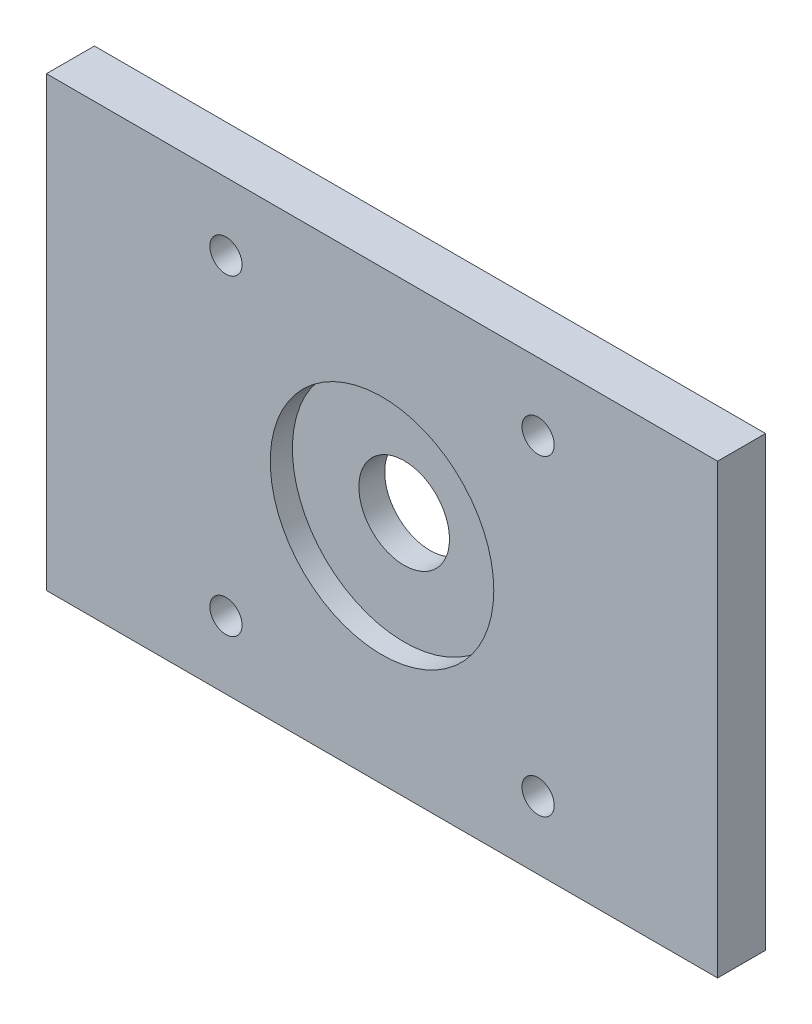
ISO-10303-21;
HEADER;
FILE_DESCRIPTION(('STEP AP214'),'2;1');
FILE_NAME('part.step','',(''),(''),'','','');
FILE_SCHEMA(('AUTOMOTIVE_DESIGN { 1 0 10303 214 1 1 1 1 }'));
ENDSEC;
DATA;
#1=APPLICATION_CONTEXT('core data for automotive mechanical design processes');
#2=APPLICATION_PROTOCOL_DEFINITION('international standard','automotive_design',2000,#1);
#3=PRODUCT_CONTEXT('',#1,'mechanical');
#4=PRODUCT('Part','Part','',(#3));
#5=PRODUCT_RELATED_PRODUCT_CATEGORY('part','',(#4));
#6=PRODUCT_DEFINITION_FORMATION('','',#4);
#7=PRODUCT_DEFINITION_CONTEXT('part definition',#1,'design');
#8=PRODUCT_DEFINITION('design','',#6,#7);
#9=PRODUCT_DEFINITION_SHAPE('','',#8);
#10=(LENGTH_UNIT() NAMED_UNIT(*) SI_UNIT(.MILLI.,.METRE.));
#11=(NAMED_UNIT(*) PLANE_ANGLE_UNIT() SI_UNIT($,.RADIAN.));
#12=(NAMED_UNIT(*) SI_UNIT($,.STERADIAN.) SOLID_ANGLE_UNIT());
#13=UNCERTAINTY_MEASURE_WITH_UNIT(LENGTH_MEASURE(1.E-05),#10,'distance_accuracy_value','');
#14=(GEOMETRIC_REPRESENTATION_CONTEXT(3) GLOBAL_UNCERTAINTY_ASSIGNED_CONTEXT((#13)) GLOBAL_UNIT_ASSIGNED_CONTEXT((#10,
#11,#12)) REPRESENTATION_CONTEXT('',''));
#15=CARTESIAN_POINT('',(0.,0.,0.));
#16=DIRECTION('',(0.,0.,1.));
#17=DIRECTION('',(1.,0.,0.));
#18=AXIS2_PLACEMENT_3D('',#15,#16,#17);
#19=CARTESIAN_POINT('',(0.,0.,4.7625));
#20=DIRECTION('',(0.,0.,-1.));
#21=DIRECTION('',(-1.,0.,0.));
#22=AXIS2_PLACEMENT_3D('',#19,#20,#21);
#23=PLANE('',#22);
#24=CARTESIAN_POINT('',(33.3248,22.225,4.7625));
#25=DIRECTION('',(0.,0.,1.));
#26=DIRECTION('',(1.,0.,0.));
#27=AXIS2_PLACEMENT_3D('',#24,#25,#26);
#28=CIRCLE('',#27,11.1);
#29=CARTESIAN_POINT('',(44.4248,22.225,4.7625));
#30=VERTEX_POINT('',#29);
#31=EDGE_CURVE('E137',#30,#30,#28,.T.);
#32=ORIENTED_EDGE('',*,*,#31,.F.);
#33=EDGE_LOOP('',(#32));
#34=FACE_BOUND('',#33,.T.);
#35=CARTESIAN_POINT('',(48.8248,37.725,4.7625));
#36=DIRECTION('',(0.,0.,1.));
#37=DIRECTION('',(1.,0.,0.));
#38=AXIS2_PLACEMENT_3D('',#35,#36,#37);
#39=CIRCLE('',#38,1.59999999999998);
#40=CARTESIAN_POINT('',(50.4248,37.725,4.7625));
#41=VERTEX_POINT('',#40);
#42=EDGE_CURVE('E133',#41,#41,#39,.T.);
#43=ORIENTED_EDGE('',*,*,#42,.F.);
#44=EDGE_LOOP('',(#43));
#45=FACE_BOUND('',#44,.T.);
#46=CARTESIAN_POINT('',(17.8248,6.72499999999999,4.7625));
#47=DIRECTION('',(0.,0.,1.));
#48=DIRECTION('',(1.,0.,0.));
#49=AXIS2_PLACEMENT_3D('',#46,#47,#48);
#50=CIRCLE('',#49,1.59999999999999);
#51=CARTESIAN_POINT('',(19.4248,6.72499999999999,4.7625));
#52=VERTEX_POINT('',#51);
#53=EDGE_CURVE('E127',#52,#52,#50,.T.);
#54=ORIENTED_EDGE('',*,*,#53,.F.);
#55=EDGE_LOOP('',(#54));
#56=FACE_BOUND('',#55,.T.);
#57=CARTESIAN_POINT('',(17.8248,37.725,4.7625));
#58=DIRECTION('',(0.,0.,1.));
#59=DIRECTION('',(1.,0.,0.));
#60=AXIS2_PLACEMENT_3D('',#57,#58,#59);
#61=CIRCLE('',#60,1.59999999999999);
#62=CARTESIAN_POINT('',(19.4248,37.725,4.7625));
#63=VERTEX_POINT('',#62);
#64=EDGE_CURVE('E121',#63,#63,#61,.T.);
#65=ORIENTED_EDGE('',*,*,#64,.F.);
#66=EDGE_LOOP('',(#65));
#67=FACE_BOUND('',#66,.T.);
#68=DIRECTION('',(0.,-1.,0.));
#69=VECTOR('',#68,1.);
#70=CARTESIAN_POINT('',(0.,0.,4.7625));
#71=LINE('',#70,#69);
#72=CARTESIAN_POINT('',(0.,44.45,4.7625));
#73=VERTEX_POINT('',#72);
#74=CARTESIAN_POINT('',(0.,0.,4.7625));
#75=VERTEX_POINT('',#74);
#76=EDGE_CURVE('E87',#73,#75,#71,.T.);
#77=ORIENTED_EDGE('',*,*,#76,.T.);
#78=DIRECTION('',(1.,0.,0.));
#79=VECTOR('',#78,1.);
#80=CARTESIAN_POINT('',(0.,0.,4.7625));
#81=LINE('',#80,#79);
#82=CARTESIAN_POINT('',(66.6496,0.,4.7625));
#83=VERTEX_POINT('',#82);
#84=EDGE_CURVE('E82',#75,#83,#81,.T.);
#85=ORIENTED_EDGE('',*,*,#84,.T.);
#86=DIRECTION('',(0.,1.,0.));
#87=VECTOR('',#86,1.);
#88=CARTESIAN_POINT('',(66.6496,0.,4.7625));
#89=LINE('',#88,#87);
#90=CARTESIAN_POINT('',(66.6496,44.45,4.7625));
#91=VERTEX_POINT('',#90);
#92=EDGE_CURVE('E85',#83,#91,#89,.T.);
#93=ORIENTED_EDGE('',*,*,#92,.T.);
#94=DIRECTION('',(-1.,0.,0.));
#95=VECTOR('',#94,1.);
#96=CARTESIAN_POINT('',(0.,44.45,4.7625));
#97=LINE('',#96,#95);
#98=EDGE_CURVE('E52',#91,#73,#97,.T.);
#99=ORIENTED_EDGE('',*,*,#98,.T.);
#100=EDGE_LOOP('',(#77,#85,#93,#99));
#101=FACE_BOUND('',#100,.T.);
#102=CARTESIAN_POINT('',(48.8248,6.72499999999999,4.7625));
#103=DIRECTION('',(0.,0.,1.));
#104=DIRECTION('',(1.,0.,0.));
#105=AXIS2_PLACEMENT_3D('',#102,#103,#104);
#106=CIRCLE('',#105,1.59999999999998);
#107=CARTESIAN_POINT('',(50.4248,6.72499999999999,4.7625));
#108=VERTEX_POINT('',#107);
#109=EDGE_CURVE('E115',#108,#108,#106,.T.);
#110=ORIENTED_EDGE('',*,*,#109,.F.);
#111=EDGE_LOOP('',(#110));
#112=FACE_BOUND('',#111,.T.);
#113=ADVANCED_FACE('F35',(#34,#45,#56,#67,#101,#112),#23,.F.);
#114=CARTESIAN_POINT('',(0.,0.,4.7625));
#115=DIRECTION('',(1.,0.,0.));
#116=DIRECTION('',(0.,0.,-1.));
#117=AXIS2_PLACEMENT_3D('',#114,#115,#116);
#118=PLANE('',#117);
#119=DIRECTION('',(0.,-1.,0.));
#120=VECTOR('',#119,1.);
#121=CARTESIAN_POINT('',(0.,0.,0.));
#122=LINE('',#121,#120);
#123=CARTESIAN_POINT('',(0.,44.45,0.));
#124=VERTEX_POINT('',#123);
#125=CARTESIAN_POINT('',(0.,0.,0.));
#126=VERTEX_POINT('',#125);
#127=EDGE_CURVE('E99',#124,#126,#122,.T.);
#128=ORIENTED_EDGE('',*,*,#127,.T.);
#129=DIRECTION('',(0.,0.,-1.));
#130=VECTOR('',#129,1.);
#131=CARTESIAN_POINT('',(0.,0.,4.7625));
#132=LINE('',#131,#130);
#133=EDGE_CURVE('E11',#75,#126,#132,.T.);
#134=ORIENTED_EDGE('',*,*,#133,.F.);
#135=ORIENTED_EDGE('',*,*,#76,.F.);
#136=DIRECTION('',(0.,0.,-1.));
#137=VECTOR('',#136,1.);
#138=CARTESIAN_POINT('',(0.,44.45,4.7625));
#139=LINE('',#138,#137);
#140=EDGE_CURVE('E95',#73,#124,#139,.T.);
#141=ORIENTED_EDGE('',*,*,#140,.T.);
#142=EDGE_LOOP('',(#128,#134,#135,#141));
#143=FACE_BOUND('',#142,.T.);
#144=ADVANCED_FACE('F37',(#143),#118,.F.);
#145=CARTESIAN_POINT('',(0.,0.,4.7625));
#146=DIRECTION('',(0.,1.,0.));
#147=DIRECTION('',(0.,0.,1.));
#148=AXIS2_PLACEMENT_3D('',#145,#146,#147);
#149=PLANE('',#148);
#150=DIRECTION('',(1.,0.,0.));
#151=VECTOR('',#150,1.);
#152=CARTESIAN_POINT('',(0.,0.,0.));
#153=LINE('',#152,#151);
#154=CARTESIAN_POINT('',(66.6496,0.,0.));
#155=VERTEX_POINT('',#154);
#156=EDGE_CURVE('E91',#126,#155,#153,.T.);
#157=ORIENTED_EDGE('',*,*,#156,.T.);
#158=DIRECTION('',(0.,0.,-1.));
#159=VECTOR('',#158,1.);
#160=CARTESIAN_POINT('',(66.6496,0.,4.7625));
#161=LINE('',#160,#159);
#162=EDGE_CURVE('E44',#83,#155,#161,.T.);
#163=ORIENTED_EDGE('',*,*,#162,.F.);
#164=ORIENTED_EDGE('',*,*,#84,.F.);
#165=ORIENTED_EDGE('',*,*,#133,.T.);
#166=EDGE_LOOP('',(#157,#163,#164,#165));
#167=FACE_BOUND('',#166,.T.);
#168=ADVANCED_FACE('F90',(#167),#149,.F.);
#169=CARTESIAN_POINT('',(66.6496,0.,4.7625));
#170=DIRECTION('',(-1.,0.,0.));
#171=DIRECTION('',(0.,0.,1.));
#172=AXIS2_PLACEMENT_3D('',#169,#170,#171);
#173=PLANE('',#172);
#174=DIRECTION('',(0.,1.,0.));
#175=VECTOR('',#174,1.);
#176=CARTESIAN_POINT('',(66.6496,0.,0.));
#177=LINE('',#176,#175);
#178=CARTESIAN_POINT('',(66.6496,44.45,0.));
#179=VERTEX_POINT('',#178);
#180=EDGE_CURVE('E69',#155,#179,#177,.T.);
#181=ORIENTED_EDGE('',*,*,#180,.T.);
#182=DIRECTION('',(0.,0.,-1.));
#183=VECTOR('',#182,1.);
#184=CARTESIAN_POINT('',(66.6496,44.45,4.7625));
#185=LINE('',#184,#183);
#186=EDGE_CURVE('E92',#91,#179,#185,.T.);
#187=ORIENTED_EDGE('',*,*,#186,.F.);
#188=ORIENTED_EDGE('',*,*,#92,.F.);
#189=ORIENTED_EDGE('',*,*,#162,.T.);
#190=EDGE_LOOP('',(#181,#187,#188,#189));
#191=FACE_BOUND('',#190,.T.);
#192=ADVANCED_FACE('F93',(#191),#173,.F.);
#193=CARTESIAN_POINT('',(0.,44.45,4.7625));
#194=DIRECTION('',(0.,-1.,0.));
#195=DIRECTION('',(0.,0.,-1.));
#196=AXIS2_PLACEMENT_3D('',#193,#194,#195);
#197=PLANE('',#196);
#198=DIRECTION('',(-1.,0.,0.));
#199=VECTOR('',#198,1.);
#200=CARTESIAN_POINT('',(0.,44.45,0.));
#201=LINE('',#200,#199);
#202=EDGE_CURVE('E75',#179,#124,#201,.T.);
#203=ORIENTED_EDGE('',*,*,#202,.T.);
#204=ORIENTED_EDGE('',*,*,#140,.F.);
#205=ORIENTED_EDGE('',*,*,#98,.F.);
#206=ORIENTED_EDGE('',*,*,#186,.T.);
#207=EDGE_LOOP('',(#203,#204,#205,#206));
#208=FACE_BOUND('',#207,.T.);
#209=ADVANCED_FACE('F107',(#208),#197,.F.);
#210=CARTESIAN_POINT('',(0.,0.,0.));
#211=DIRECTION('',(0.,0.,-1.));
#212=DIRECTION('',(-1.,0.,0.));
#213=AXIS2_PLACEMENT_3D('',#210,#211,#212);
#214=PLANE('',#213);
#215=CARTESIAN_POINT('',(33.3248,22.225,0.));
#216=DIRECTION('',(0.,0.,1.));
#217=DIRECTION('',(1.,0.,0.));
#218=AXIS2_PLACEMENT_3D('',#215,#216,#217);
#219=CIRCLE('',#218,4.5);
#220=CARTESIAN_POINT('',(37.8248,22.225,0.));
#221=VERTEX_POINT('',#220);
#222=EDGE_CURVE('E140',#221,#221,#219,.T.);
#223=ORIENTED_EDGE('',*,*,#222,.T.);
#224=EDGE_LOOP('',(#223));
#225=FACE_BOUND('',#224,.T.);
#226=CARTESIAN_POINT('',(48.8248,37.725,0.));
#227=DIRECTION('',(0.,0.,1.));
#228=DIRECTION('',(1.,0.,0.));
#229=AXIS2_PLACEMENT_3D('',#226,#227,#228);
#230=CIRCLE('',#229,1.6);
#231=CARTESIAN_POINT('',(50.4248,37.725,0.));
#232=VERTEX_POINT('',#231);
#233=EDGE_CURVE('E130',#232,#232,#230,.T.);
#234=ORIENTED_EDGE('',*,*,#233,.T.);
#235=EDGE_LOOP('',(#234));
#236=FACE_BOUND('',#235,.T.);
#237=CARTESIAN_POINT('',(17.8248,6.72499999999999,0.));
#238=DIRECTION('',(0.,0.,1.));
#239=DIRECTION('',(1.,0.,0.));
#240=AXIS2_PLACEMENT_3D('',#237,#238,#239);
#241=CIRCLE('',#240,1.6);
#242=CARTESIAN_POINT('',(19.4248,6.72499999999999,0.));
#243=VERTEX_POINT('',#242);
#244=EDGE_CURVE('E124',#243,#243,#241,.T.);
#245=ORIENTED_EDGE('',*,*,#244,.T.);
#246=EDGE_LOOP('',(#245));
#247=FACE_BOUND('',#246,.T.);
#248=CARTESIAN_POINT('',(17.8248,37.725,0.));
#249=DIRECTION('',(0.,0.,1.));
#250=DIRECTION('',(1.,0.,0.));
#251=AXIS2_PLACEMENT_3D('',#248,#249,#250);
#252=CIRCLE('',#251,1.6);
#253=CARTESIAN_POINT('',(19.4248,37.725,0.));
#254=VERTEX_POINT('',#253);
#255=EDGE_CURVE('E118',#254,#254,#252,.T.);
#256=ORIENTED_EDGE('',*,*,#255,.T.);
#257=EDGE_LOOP('',(#256));
#258=FACE_BOUND('',#257,.T.);
#259=CARTESIAN_POINT('',(48.8248,6.72499999999999,0.));
#260=DIRECTION('',(0.,0.,1.));
#261=DIRECTION('',(1.,0.,0.));
#262=AXIS2_PLACEMENT_3D('',#259,#260,#261);
#263=CIRCLE('',#262,1.6);
#264=CARTESIAN_POINT('',(50.4248,6.72499999999999,0.));
#265=VERTEX_POINT('',#264);
#266=EDGE_CURVE('E102',#265,#265,#263,.T.);
#267=ORIENTED_EDGE('',*,*,#266,.T.);
#268=EDGE_LOOP('',(#267));
#269=FACE_BOUND('',#268,.T.);
#270=ORIENTED_EDGE('',*,*,#127,.F.);
#271=ORIENTED_EDGE('',*,*,#202,.F.);
#272=ORIENTED_EDGE('',*,*,#180,.F.);
#273=ORIENTED_EDGE('',*,*,#156,.F.);
#274=EDGE_LOOP('',(#270,#271,#272,#273));
#275=FACE_BOUND('',#274,.T.);
#276=ADVANCED_FACE('F110',(#225,#236,#247,#258,#269,#275),#214,.T.);
#277=CARTESIAN_POINT('',(48.8248,6.72499999999999,4.7625));
#278=DIRECTION('',(0.,0.,1.));
#279=DIRECTION('',(1.,0.,0.));
#280=AXIS2_PLACEMENT_3D('',#277,#278,#279);
#281=CYLINDRICAL_SURFACE('',#280,1.59999999999999);
#282=ORIENTED_EDGE('',*,*,#266,.F.);
#283=EDGE_LOOP('',(#282));
#284=FACE_BOUND('',#283,.T.);
#285=ORIENTED_EDGE('',*,*,#109,.T.);
#286=EDGE_LOOP('',(#285));
#287=FACE_BOUND('',#286,.T.);
#288=ADVANCED_FACE('F182',(#284,#287),#281,.F.);
#289=CARTESIAN_POINT('',(17.8248,37.725,4.7625));
#290=DIRECTION('',(0.,0.,1.));
#291=DIRECTION('',(1.,0.,0.));
#292=AXIS2_PLACEMENT_3D('',#289,#290,#291);
#293=CYLINDRICAL_SURFACE('',#292,1.59999999999999);
#294=ORIENTED_EDGE('',*,*,#255,.F.);
#295=EDGE_LOOP('',(#294));
#296=FACE_BOUND('',#295,.T.);
#297=ORIENTED_EDGE('',*,*,#64,.T.);
#298=EDGE_LOOP('',(#297));
#299=FACE_BOUND('',#298,.T.);
#300=ADVANCED_FACE('F179',(#296,#299),#293,.F.);
#301=CARTESIAN_POINT('',(17.8248,6.72499999999999,4.7625));
#302=DIRECTION('',(0.,0.,1.));
#303=DIRECTION('',(1.,0.,0.));
#304=AXIS2_PLACEMENT_3D('',#301,#302,#303);
#305=CYLINDRICAL_SURFACE('',#304,1.59999999999999);
#306=ORIENTED_EDGE('',*,*,#244,.F.);
#307=EDGE_LOOP('',(#306));
#308=FACE_BOUND('',#307,.T.);
#309=ORIENTED_EDGE('',*,*,#53,.T.);
#310=EDGE_LOOP('',(#309));
#311=FACE_BOUND('',#310,.T.);
#312=ADVANCED_FACE('F181',(#308,#311),#305,.F.);
#313=CARTESIAN_POINT('',(48.8248,37.725,4.7625));
#314=DIRECTION('',(0.,0.,1.));
#315=DIRECTION('',(1.,0.,0.));
#316=AXIS2_PLACEMENT_3D('',#313,#314,#315);
#317=CYLINDRICAL_SURFACE('',#316,1.59999999999999);
#318=ORIENTED_EDGE('',*,*,#233,.F.);
#319=EDGE_LOOP('',(#318));
#320=FACE_BOUND('',#319,.T.);
#321=ORIENTED_EDGE('',*,*,#42,.T.);
#322=EDGE_LOOP('',(#321));
#323=FACE_BOUND('',#322,.T.);
#324=ADVANCED_FACE('F166',(#320,#323),#317,.F.);
#325=CARTESIAN_POINT('',(33.3248,22.225,2.5625));
#326=DIRECTION('',(0.,0.,1.));
#327=DIRECTION('',(1.,0.,0.));
#328=AXIS2_PLACEMENT_3D('',#325,#326,#327);
#329=CYLINDRICAL_SURFACE('',#328,11.1);
#330=CARTESIAN_POINT('',(33.3248,22.225,2.5625));
#331=DIRECTION('',(0.,0.,1.));
#332=DIRECTION('',(1.,0.,0.));
#333=AXIS2_PLACEMENT_3D('',#330,#331,#332);
#334=CIRCLE('',#333,11.1);
#335=CARTESIAN_POINT('',(44.4248,22.225,2.5625));
#336=VERTEX_POINT('',#335);
#337=EDGE_CURVE('E136',#336,#336,#334,.T.);
#338=ORIENTED_EDGE('',*,*,#337,.F.);
#339=EDGE_LOOP('',(#338));
#340=FACE_BOUND('',#339,.T.);
#341=ORIENTED_EDGE('',*,*,#31,.T.);
#342=EDGE_LOOP('',(#341));
#343=FACE_BOUND('',#342,.T.);
#344=ADVANCED_FACE('F160',(#340,#343),#329,.F.);
#345=CARTESIAN_POINT('',(33.3248,22.225,2.5625));
#346=DIRECTION('',(0.,0.,1.));
#347=DIRECTION('',(1.,0.,0.));
#348=AXIS2_PLACEMENT_3D('',#345,#346,#347);
#349=PLANE('',#348);
#350=CARTESIAN_POINT('',(33.3248,22.225,2.5625));
#351=DIRECTION('',(0.,0.,1.));
#352=DIRECTION('',(1.,0.,0.));
#353=AXIS2_PLACEMENT_3D('',#350,#351,#352);
#354=CIRCLE('',#353,4.5);
#355=CARTESIAN_POINT('',(37.8248,22.225,2.5625));
#356=VERTEX_POINT('',#355);
#357=EDGE_CURVE('E143',#356,#356,#354,.T.);
#358=ORIENTED_EDGE('',*,*,#357,.F.);
#359=EDGE_LOOP('',(#358));
#360=FACE_BOUND('',#359,.T.);
#361=ORIENTED_EDGE('',*,*,#337,.T.);
#362=EDGE_LOOP('',(#361));
#363=FACE_BOUND('',#362,.T.);
#364=ADVANCED_FACE('F154',(#360,#363),#349,.T.);
#365=CARTESIAN_POINT('',(33.3248,22.225,0.));
#366=DIRECTION('',(0.,0.,1.));
#367=DIRECTION('',(1.,0.,0.));
#368=AXIS2_PLACEMENT_3D('',#365,#366,#367);
#369=CYLINDRICAL_SURFACE('',#368,4.5);
#370=ORIENTED_EDGE('',*,*,#222,.F.);
#371=EDGE_LOOP('',(#370));
#372=FACE_BOUND('',#371,.T.);
#373=ORIENTED_EDGE('',*,*,#357,.T.);
#374=EDGE_LOOP('',(#373));
#375=FACE_BOUND('',#374,.T.);
#376=ADVANCED_FACE('F151',(#372,#375),#369,.F.);
#377=CLOSED_SHELL('',(#113,#144,#168,#192,#209,#276,#288,#300,#312,#324,#344,#364,#376));
#378=MANIFOLD_SOLID_BREP('B2',#377);
#379=ADVANCED_BREP_SHAPE_REPRESENTATION('',(#18,#378),#14);
#380=SHAPE_DEFINITION_REPRESENTATION(#9,#379);
ENDSEC;
END-ISO-10303-21;
